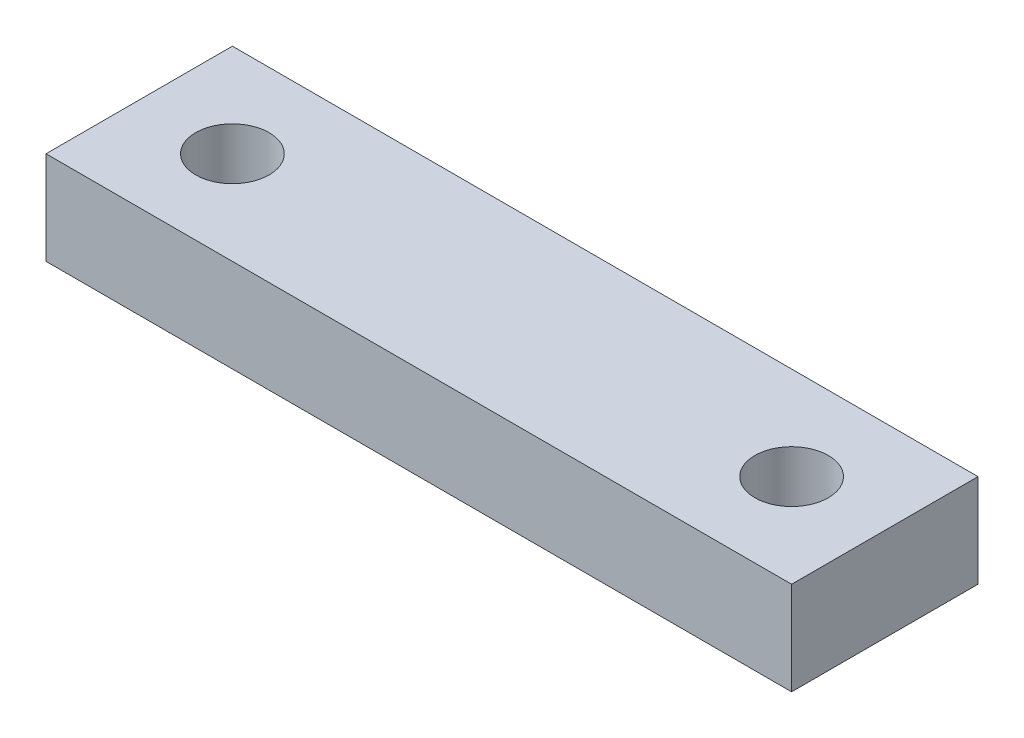
ISO-10303-21;
HEADER;
FILE_DESCRIPTION(('STEP AP214'),'2;1');
FILE_NAME('part.step','',(''),(''),'','','');
FILE_SCHEMA(('AUTOMOTIVE_DESIGN { 1 0 10303 214 1 1 1 1 }'));
ENDSEC;
DATA;
#1=APPLICATION_CONTEXT('core data for automotive mechanical design processes');
#2=APPLICATION_PROTOCOL_DEFINITION('international standard','automotive_design',2000,#1);
#3=PRODUCT_CONTEXT('',#1,'mechanical');
#4=PRODUCT('Part','Part','',(#3));
#5=PRODUCT_RELATED_PRODUCT_CATEGORY('part','',(#4));
#6=PRODUCT_DEFINITION_FORMATION('','',#4);
#7=PRODUCT_DEFINITION_CONTEXT('part definition',#1,'design');
#8=PRODUCT_DEFINITION('design','',#6,#7);
#9=PRODUCT_DEFINITION_SHAPE('','',#8);
#10=(LENGTH_UNIT() NAMED_UNIT(*) SI_UNIT(.MILLI.,.METRE.));
#11=(NAMED_UNIT(*) PLANE_ANGLE_UNIT() SI_UNIT($,.RADIAN.));
#12=(NAMED_UNIT(*) SI_UNIT($,.STERADIAN.) SOLID_ANGLE_UNIT());
#13=UNCERTAINTY_MEASURE_WITH_UNIT(LENGTH_MEASURE(1.E-05),#10,'distance_accuracy_value','');
#14=(GEOMETRIC_REPRESENTATION_CONTEXT(3) GLOBAL_UNCERTAINTY_ASSIGNED_CONTEXT((#13)) GLOBAL_UNIT_ASSIGNED_CONTEXT((#10,
#11,#12)) REPRESENTATION_CONTEXT('',''));
#15=CARTESIAN_POINT('',(0.,0.,0.));
#16=DIRECTION('',(0.,0.,1.));
#17=DIRECTION('',(1.,0.,0.));
#18=AXIS2_PLACEMENT_3D('',#15,#16,#17);
#19=CARTESIAN_POINT('',(0.,6.35,0.));
#20=DIRECTION('',(1.,0.,0.));
#21=DIRECTION('',(0.,0.,-1.));
#22=AXIS2_PLACEMENT_3D('',#19,#20,#21);
#23=PLANE('',#22);
#24=DIRECTION('',(0.,0.,1.));
#25=VECTOR('',#24,1.);
#26=CARTESIAN_POINT('',(0.,0.,0.));
#27=LINE('',#26,#25);
#28=CARTESIAN_POINT('',(0.,0.,-12.7));
#29=VERTEX_POINT('',#28);
#30=CARTESIAN_POINT('',(0.,0.,0.));
#31=VERTEX_POINT('',#30);
#32=EDGE_CURVE('E96',#29,#31,#27,.T.);
#33=ORIENTED_EDGE('',*,*,#32,.T.);
#34=DIRECTION('',(0.,-1.,0.));
#35=VECTOR('',#34,1.);
#36=CARTESIAN_POINT('',(0.,6.35,0.));
#37=LINE('',#36,#35);
#38=CARTESIAN_POINT('',(0.,6.35,0.));
#39=VERTEX_POINT('',#38);
#40=EDGE_CURVE('E11',#39,#31,#37,.T.);
#41=ORIENTED_EDGE('',*,*,#40,.F.);
#42=DIRECTION('',(0.,0.,1.));
#43=VECTOR('',#42,1.);
#44=CARTESIAN_POINT('',(0.,6.35,0.));
#45=LINE('',#44,#43);
#46=CARTESIAN_POINT('',(0.,6.35,-12.7));
#47=VERTEX_POINT('',#46);
#48=EDGE_CURVE('E84',#47,#39,#45,.T.);
#49=ORIENTED_EDGE('',*,*,#48,.F.);
#50=DIRECTION('',(0.,-1.,0.));
#51=VECTOR('',#50,1.);
#52=CARTESIAN_POINT('',(0.,6.35,-12.7));
#53=LINE('',#52,#51);
#54=EDGE_CURVE('E92',#47,#29,#53,.T.);
#55=ORIENTED_EDGE('',*,*,#54,.T.);
#56=EDGE_LOOP('',(#33,#41,#49,#55));
#57=FACE_BOUND('',#56,.T.);
#58=ADVANCED_FACE('F33',(#57),#23,.F.);
#59=CARTESIAN_POINT('',(0.,6.35,0.));
#60=DIRECTION('',(0.,0.,-1.));
#61=DIRECTION('',(-1.,0.,0.));
#62=AXIS2_PLACEMENT_3D('',#59,#60,#61);
#63=PLANE('',#62);
#64=DIRECTION('',(1.,0.,0.));
#65=VECTOR('',#64,1.);
#66=CARTESIAN_POINT('',(0.,0.,0.));
#67=LINE('',#66,#65);
#68=CARTESIAN_POINT('',(50.8,0.,0.));
#69=VERTEX_POINT('',#68);
#70=EDGE_CURVE('E88',#31,#69,#67,.T.);
#71=ORIENTED_EDGE('',*,*,#70,.T.);
#72=DIRECTION('',(0.,-1.,0.));
#73=VECTOR('',#72,1.);
#74=CARTESIAN_POINT('',(50.8,6.35,0.));
#75=LINE('',#74,#73);
#76=CARTESIAN_POINT('',(50.8,6.35,0.));
#77=VERTEX_POINT('',#76);
#78=EDGE_CURVE('E41',#77,#69,#75,.T.);
#79=ORIENTED_EDGE('',*,*,#78,.F.);
#80=DIRECTION('',(1.,0.,0.));
#81=VECTOR('',#80,1.);
#82=CARTESIAN_POINT('',(0.,6.35,0.));
#83=LINE('',#82,#81);
#84=EDGE_CURVE('E79',#39,#77,#83,.T.);
#85=ORIENTED_EDGE('',*,*,#84,.F.);
#86=ORIENTED_EDGE('',*,*,#40,.T.);
#87=EDGE_LOOP('',(#71,#79,#85,#86));
#88=FACE_BOUND('',#87,.T.);
#89=ADVANCED_FACE('F87',(#88),#63,.F.);
#90=CARTESIAN_POINT('',(50.8,6.35,0.));
#91=DIRECTION('',(-1.,0.,0.));
#92=DIRECTION('',(0.,0.,1.));
#93=AXIS2_PLACEMENT_3D('',#90,#91,#92);
#94=PLANE('',#93);
#95=DIRECTION('',(0.,0.,-1.));
#96=VECTOR('',#95,1.);
#97=CARTESIAN_POINT('',(50.8,0.,0.));
#98=LINE('',#97,#96);
#99=CARTESIAN_POINT('',(50.8,0.,-12.7));
#100=VERTEX_POINT('',#99);
#101=EDGE_CURVE('E66',#69,#100,#98,.T.);
#102=ORIENTED_EDGE('',*,*,#101,.T.);
#103=DIRECTION('',(0.,-1.,0.));
#104=VECTOR('',#103,1.);
#105=CARTESIAN_POINT('',(50.8,6.35,-12.7));
#106=LINE('',#105,#104);
#107=CARTESIAN_POINT('',(50.8,6.35,-12.7));
#108=VERTEX_POINT('',#107);
#109=EDGE_CURVE('E89',#108,#100,#106,.T.);
#110=ORIENTED_EDGE('',*,*,#109,.F.);
#111=DIRECTION('',(0.,0.,-1.));
#112=VECTOR('',#111,1.);
#113=CARTESIAN_POINT('',(50.8,6.35,0.));
#114=LINE('',#113,#112);
#115=EDGE_CURVE('E82',#77,#108,#114,.T.);
#116=ORIENTED_EDGE('',*,*,#115,.F.);
#117=ORIENTED_EDGE('',*,*,#78,.T.);
#118=EDGE_LOOP('',(#102,#110,#116,#117));
#119=FACE_BOUND('',#118,.T.);
#120=ADVANCED_FACE('F90',(#119),#94,.F.);
#121=CARTESIAN_POINT('',(0.,6.35,-12.7));
#122=DIRECTION('',(0.,0.,1.));
#123=DIRECTION('',(1.,0.,0.));
#124=AXIS2_PLACEMENT_3D('',#121,#122,#123);
#125=PLANE('',#124);
#126=DIRECTION('',(-1.,0.,0.));
#127=VECTOR('',#126,1.);
#128=CARTESIAN_POINT('',(0.,0.,-12.7));
#129=LINE('',#128,#127);
#130=EDGE_CURVE('E72',#100,#29,#129,.T.);
#131=ORIENTED_EDGE('',*,*,#130,.T.);
#132=ORIENTED_EDGE('',*,*,#54,.F.);
#133=DIRECTION('',(-1.,0.,0.));
#134=VECTOR('',#133,1.);
#135=CARTESIAN_POINT('',(0.,6.35,-12.7));
#136=LINE('',#135,#134);
#137=EDGE_CURVE('E49',#108,#47,#136,.T.);
#138=ORIENTED_EDGE('',*,*,#137,.F.);
#139=ORIENTED_EDGE('',*,*,#109,.T.);
#140=EDGE_LOOP('',(#131,#132,#138,#139));
#141=FACE_BOUND('',#140,.T.);
#142=ADVANCED_FACE('F104',(#141),#125,.F.);
#143=CARTESIAN_POINT('',(0.,6.35,0.));
#144=DIRECTION('',(0.,-1.,0.));
#145=DIRECTION('',(0.,0.,-1.));
#146=AXIS2_PLACEMENT_3D('',#143,#144,#145);
#147=PLANE('',#146);
#148=CARTESIAN_POINT('',(6.35,6.35,-6.35));
#149=DIRECTION('',(0.,1.,0.));
#150=DIRECTION('',(0.,0.,1.));
#151=AXIS2_PLACEMENT_3D('',#148,#149,#150);
#152=CIRCLE('',#151,2.49999999999999);
#153=CARTESIAN_POINT('',(6.35,6.35,-3.85000000000001));
#154=VERTEX_POINT('',#153);
#155=EDGE_CURVE('E118',#154,#154,#152,.T.);
#156=ORIENTED_EDGE('',*,*,#155,.F.);
#157=EDGE_LOOP('',(#156));
#158=FACE_BOUND('',#157,.T.);
#159=CARTESIAN_POINT('',(44.45,6.35,-6.35));
#160=DIRECTION('',(0.,1.,0.));
#161=DIRECTION('',(0.,0.,1.));
#162=AXIS2_PLACEMENT_3D('',#159,#160,#161);
#163=CIRCLE('',#162,2.49999999999999);
#164=CARTESIAN_POINT('',(44.45,6.35,-3.85000000000001));
#165=VERTEX_POINT('',#164);
#166=EDGE_CURVE('E112',#165,#165,#163,.T.);
#167=ORIENTED_EDGE('',*,*,#166,.F.);
#168=EDGE_LOOP('',(#167));
#169=FACE_BOUND('',#168,.T.);
#170=ORIENTED_EDGE('',*,*,#48,.T.);
#171=ORIENTED_EDGE('',*,*,#84,.T.);
#172=ORIENTED_EDGE('',*,*,#115,.T.);
#173=ORIENTED_EDGE('',*,*,#137,.T.);
#174=EDGE_LOOP('',(#170,#171,#172,#173));
#175=FACE_BOUND('',#174,.T.);
#176=ADVANCED_FACE('F80',(#158,#169,#175),#147,.F.);
#177=CARTESIAN_POINT('',(0.,0.,0.));
#178=DIRECTION('',(0.,-1.,0.));
#179=DIRECTION('',(0.,0.,-1.));
#180=AXIS2_PLACEMENT_3D('',#177,#178,#179);
#181=PLANE('',#180);
#182=CARTESIAN_POINT('',(6.35,0.,-6.35));
#183=DIRECTION('',(0.,1.,0.));
#184=DIRECTION('',(0.,0.,1.));
#185=AXIS2_PLACEMENT_3D('',#182,#183,#184);
#186=CIRCLE('',#185,2.5);
#187=CARTESIAN_POINT('',(6.35,0.,-3.85));
#188=VERTEX_POINT('',#187);
#189=EDGE_CURVE('E115',#188,#188,#186,.T.);
#190=ORIENTED_EDGE('',*,*,#189,.T.);
#191=EDGE_LOOP('',(#190));
#192=FACE_BOUND('',#191,.T.);
#193=CARTESIAN_POINT('',(44.45,0.,-6.35));
#194=DIRECTION('',(0.,1.,0.));
#195=DIRECTION('',(0.,0.,1.));
#196=AXIS2_PLACEMENT_3D('',#193,#194,#195);
#197=CIRCLE('',#196,2.5);
#198=CARTESIAN_POINT('',(44.45,0.,-3.85));
#199=VERTEX_POINT('',#198);
#200=EDGE_CURVE('E99',#199,#199,#197,.T.);
#201=ORIENTED_EDGE('',*,*,#200,.T.);
#202=EDGE_LOOP('',(#201));
#203=FACE_BOUND('',#202,.T.);
#204=ORIENTED_EDGE('',*,*,#32,.F.);
#205=ORIENTED_EDGE('',*,*,#130,.F.);
#206=ORIENTED_EDGE('',*,*,#101,.F.);
#207=ORIENTED_EDGE('',*,*,#70,.F.);
#208=EDGE_LOOP('',(#204,#205,#206,#207));
#209=FACE_BOUND('',#208,.T.);
#210=ADVANCED_FACE('F107',(#192,#203,#209),#181,.T.);
#211=CARTESIAN_POINT('',(44.45,6.35,-6.35));
#212=DIRECTION('',(0.,1.,0.));
#213=DIRECTION('',(0.,0.,1.));
#214=AXIS2_PLACEMENT_3D('',#211,#212,#213);
#215=CYLINDRICAL_SURFACE('',#214,2.5);
#216=ORIENTED_EDGE('',*,*,#200,.F.);
#217=EDGE_LOOP('',(#216));
#218=FACE_BOUND('',#217,.T.);
#219=ORIENTED_EDGE('',*,*,#166,.T.);
#220=EDGE_LOOP('',(#219));
#221=FACE_BOUND('',#220,.T.);
#222=ADVANCED_FACE('F129',(#218,#221),#215,.F.);
#223=CARTESIAN_POINT('',(6.35,6.35,-6.35));
#224=DIRECTION('',(0.,1.,0.));
#225=DIRECTION('',(0.,0.,1.));
#226=AXIS2_PLACEMENT_3D('',#223,#224,#225);
#227=CYLINDRICAL_SURFACE('',#226,2.49999999999999);
#228=ORIENTED_EDGE('',*,*,#189,.F.);
#229=EDGE_LOOP('',(#228));
#230=FACE_BOUND('',#229,.T.);
#231=ORIENTED_EDGE('',*,*,#155,.T.);
#232=EDGE_LOOP('',(#231));
#233=FACE_BOUND('',#232,.T.);
#234=ADVANCED_FACE('F122',(#230,#233),#227,.F.);
#235=CLOSED_SHELL('',(#58,#89,#120,#142,#176,#210,#222,#234));
#236=MANIFOLD_SOLID_BREP('B2',#235);
#237=ADVANCED_BREP_SHAPE_REPRESENTATION('',(#18,#236),#14);
#238=SHAPE_DEFINITION_REPRESENTATION(#9,#237);
ENDSEC;
END-ISO-10303-21;
